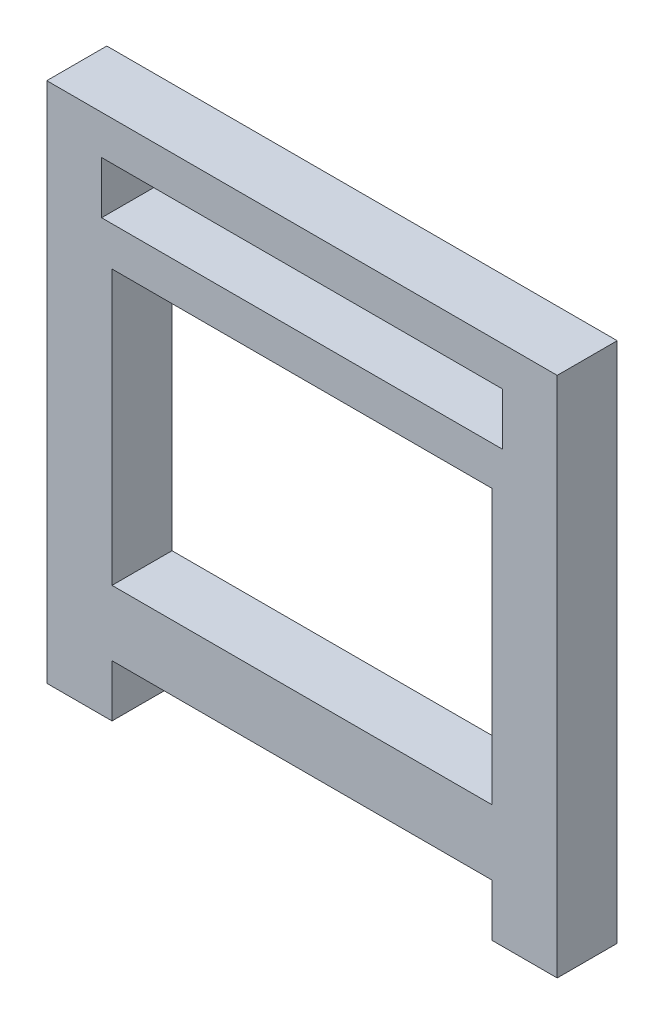
ISO-10303-21;
HEADER;
FILE_DESCRIPTION(('STEP AP214'),'2;1');
FILE_NAME('part.step','',(''),(''),'','','');
FILE_SCHEMA(('AUTOMOTIVE_DESIGN { 1 0 10303 214 1 1 1 1 }'));
ENDSEC;
DATA;
#1=APPLICATION_CONTEXT('core data for automotive mechanical design processes');
#2=APPLICATION_PROTOCOL_DEFINITION('international standard','automotive_design',2000,#1);
#3=PRODUCT_CONTEXT('',#1,'mechanical');
#4=PRODUCT('Part','Part','',(#3));
#5=PRODUCT_RELATED_PRODUCT_CATEGORY('part','',(#4));
#6=PRODUCT_DEFINITION_FORMATION('','',#4);
#7=PRODUCT_DEFINITION_CONTEXT('part definition',#1,'design');
#8=PRODUCT_DEFINITION('design','',#6,#7);
#9=PRODUCT_DEFINITION_SHAPE('','',#8);
#10=(LENGTH_UNIT() NAMED_UNIT(*) SI_UNIT(.MILLI.,.METRE.));
#11=(NAMED_UNIT(*) PLANE_ANGLE_UNIT() SI_UNIT($,.RADIAN.));
#12=(NAMED_UNIT(*) SI_UNIT($,.STERADIAN.) SOLID_ANGLE_UNIT());
#13=UNCERTAINTY_MEASURE_WITH_UNIT(LENGTH_MEASURE(1.E-05),#10,'distance_accuracy_value','');
#14=(GEOMETRIC_REPRESENTATION_CONTEXT(3) GLOBAL_UNCERTAINTY_ASSIGNED_CONTEXT((#13)) GLOBAL_UNIT_ASSIGNED_CONTEXT((#10,
#11,#12)) REPRESENTATION_CONTEXT('',''));
#15=CARTESIAN_POINT('',(0.,0.,0.));
#16=DIRECTION('',(0.,0.,1.));
#17=DIRECTION('',(1.,0.,0.));
#18=AXIS2_PLACEMENT_3D('',#15,#16,#17);
#19=CARTESIAN_POINT('',(0.,0.,2.3));
#20=DIRECTION('',(0.,0.,-1.));
#21=DIRECTION('',(-1.,0.,0.));
#22=AXIS2_PLACEMENT_3D('',#19,#20,#21);
#23=PLANE('',#22);
#24=DIRECTION('',(0.,1.,0.));
#25=VECTOR('',#24,1.);
#26=CARTESIAN_POINT('',(17.06,2.5,2.3));
#27=LINE('',#26,#25);
#28=CARTESIAN_POINT('',(17.06,2.5,2.3));
#29=VERTEX_POINT('',#28);
#30=CARTESIAN_POINT('',(17.06,13.,2.3));
#31=VERTEX_POINT('',#30);
#32=EDGE_CURVE('E188',#29,#31,#27,.T.);
#33=ORIENTED_EDGE('',*,*,#32,.F.);
#34=DIRECTION('',(1.,0.,0.));
#35=VECTOR('',#34,1.);
#36=CARTESIAN_POINT('',(2.5,2.5,2.3));
#37=LINE('',#36,#35);
#38=CARTESIAN_POINT('',(2.5,2.5,2.3));
#39=VERTEX_POINT('',#38);
#40=EDGE_CURVE('E196',#39,#29,#37,.T.);
#41=ORIENTED_EDGE('',*,*,#40,.F.);
#42=DIRECTION('',(0.,-1.,0.));
#43=VECTOR('',#42,1.);
#44=CARTESIAN_POINT('',(2.5,2.5,2.3));
#45=LINE('',#44,#43);
#46=CARTESIAN_POINT('',(2.5,13.,2.3));
#47=VERTEX_POINT('',#46);
#48=EDGE_CURVE('E193',#47,#39,#45,.T.);
#49=ORIENTED_EDGE('',*,*,#48,.F.);
#50=DIRECTION('',(-1.,0.,0.));
#51=VECTOR('',#50,1.);
#52=CARTESIAN_POINT('',(2.5,13.,2.3));
#53=LINE('',#52,#51);
#54=EDGE_CURVE('E190',#31,#47,#53,.T.);
#55=ORIENTED_EDGE('',*,*,#54,.F.);
#56=EDGE_LOOP('',(#33,#41,#49,#55));
#57=FACE_BOUND('',#56,.T.);
#58=DIRECTION('',(0.,-1.,0.));
#59=VECTOR('',#58,1.);
#60=CARTESIAN_POINT('',(0.,0.,2.3));
#61=LINE('',#60,#59);
#62=CARTESIAN_POINT('',(0.,18.,2.3));
#63=VERTEX_POINT('',#62);
#64=CARTESIAN_POINT('',(0.,-2.,2.3));
#65=VERTEX_POINT('',#64);
#66=EDGE_CURVE('E219',#63,#65,#61,.T.);
#67=ORIENTED_EDGE('',*,*,#66,.T.);
#68=DIRECTION('',(1.,0.,0.));
#69=VECTOR('',#68,1.);
#70=CARTESIAN_POINT('',(0.,-2.,2.3));
#71=LINE('',#70,#69);
#72=CARTESIAN_POINT('',(2.5,-2.,2.3));
#73=VERTEX_POINT('',#72);
#74=EDGE_CURVE('E221',#65,#73,#71,.T.);
#75=ORIENTED_EDGE('',*,*,#74,.T.);
#76=DIRECTION('',(0.,1.,0.));
#77=VECTOR('',#76,1.);
#78=CARTESIAN_POINT('',(2.5,-2.,2.3));
#79=LINE('',#78,#77);
#80=CARTESIAN_POINT('',(2.5,0.,2.3));
#81=VERTEX_POINT('',#80);
#82=EDGE_CURVE('E224',#73,#81,#79,.T.);
#83=ORIENTED_EDGE('',*,*,#82,.T.);
#84=DIRECTION('',(1.,0.,0.));
#85=VECTOR('',#84,1.);
#86=CARTESIAN_POINT('',(2.5,0.,2.3));
#87=LINE('',#86,#85);
#88=CARTESIAN_POINT('',(17.06,0.,2.3));
#89=VERTEX_POINT('',#88);
#90=EDGE_CURVE('E226',#81,#89,#87,.T.);
#91=ORIENTED_EDGE('',*,*,#90,.T.);
#92=DIRECTION('',(0.,-1.,0.));
#93=VECTOR('',#92,1.);
#94=CARTESIAN_POINT('',(17.06,-2.,2.3));
#95=LINE('',#94,#93);
#96=CARTESIAN_POINT('',(17.06,-2.,2.3));
#97=VERTEX_POINT('',#96);
#98=EDGE_CURVE('E228',#89,#97,#95,.T.);
#99=ORIENTED_EDGE('',*,*,#98,.T.);
#100=DIRECTION('',(1.,0.,0.));
#101=VECTOR('',#100,1.);
#102=CARTESIAN_POINT('',(19.56,-2.,2.3));
#103=LINE('',#102,#101);
#104=CARTESIAN_POINT('',(19.56,-2.,2.3));
#105=VERTEX_POINT('',#104);
#106=EDGE_CURVE('E230',#97,#105,#103,.T.);
#107=ORIENTED_EDGE('',*,*,#106,.T.);
#108=DIRECTION('',(0.,1.,0.));
#109=VECTOR('',#108,1.);
#110=CARTESIAN_POINT('',(19.56,0.,2.3));
#111=LINE('',#110,#109);
#112=CARTESIAN_POINT('',(19.56,18.,2.3));
#113=VERTEX_POINT('',#112);
#114=EDGE_CURVE('E232',#105,#113,#111,.T.);
#115=ORIENTED_EDGE('',*,*,#114,.T.);
#116=DIRECTION('',(-1.,0.,0.));
#117=VECTOR('',#116,1.);
#118=CARTESIAN_POINT('',(0.,18.,2.3));
#119=LINE('',#118,#117);
#120=EDGE_CURVE('E234',#113,#63,#119,.T.);
#121=ORIENTED_EDGE('',*,*,#120,.T.);
#122=EDGE_LOOP('',(#67,#75,#83,#91,#99,#107,#115,#121));
#123=FACE_BOUND('',#122,.T.);
#124=DIRECTION('',(0.,-1.,0.));
#125=VECTOR('',#124,1.);
#126=CARTESIAN_POINT('',(2.1,14.5,2.3));
#127=LINE('',#126,#125);
#128=CARTESIAN_POINT('',(2.1,16.5,2.3));
#129=VERTEX_POINT('',#128);
#130=CARTESIAN_POINT('',(2.1,14.5,2.3));
#131=VERTEX_POINT('',#130);
#132=EDGE_CURVE('E152',#129,#131,#127,.T.);
#133=ORIENTED_EDGE('',*,*,#132,.F.);
#134=DIRECTION('',(-1.,0.,0.));
#135=VECTOR('',#134,1.);
#136=CARTESIAN_POINT('',(2.1,16.5,2.3));
#137=LINE('',#136,#135);
#138=CARTESIAN_POINT('',(17.46,16.5,2.3));
#139=VERTEX_POINT('',#138);
#140=EDGE_CURVE('E174',#139,#129,#137,.T.);
#141=ORIENTED_EDGE('',*,*,#140,.F.);
#142=DIRECTION('',(0.,1.,0.));
#143=VECTOR('',#142,1.);
#144=CARTESIAN_POINT('',(17.46,14.5,2.3));
#145=LINE('',#144,#143);
#146=CARTESIAN_POINT('',(17.46,14.5,2.3));
#147=VERTEX_POINT('',#146);
#148=EDGE_CURVE('E172',#147,#139,#145,.T.);
#149=ORIENTED_EDGE('',*,*,#148,.F.);
#150=DIRECTION('',(1.,0.,0.));
#151=VECTOR('',#150,1.);
#152=CARTESIAN_POINT('',(2.1,14.5,2.3));
#153=LINE('',#152,#151);
#154=EDGE_CURVE('E160',#131,#147,#153,.T.);
#155=ORIENTED_EDGE('',*,*,#154,.F.);
#156=EDGE_LOOP('',(#133,#141,#149,#155));
#157=FACE_BOUND('',#156,.T.);
#158=ADVANCED_FACE('F39',(#57,#123,#157),#23,.F.);
#159=CARTESIAN_POINT('',(0.,0.,0.));
#160=DIRECTION('',(0.,0.,-1.));
#161=DIRECTION('',(-1.,0.,0.));
#162=AXIS2_PLACEMENT_3D('',#159,#160,#161);
#163=PLANE('',#162);
#164=DIRECTION('',(0.,-1.,0.));
#165=VECTOR('',#164,1.);
#166=CARTESIAN_POINT('',(0.,0.,0.));
#167=LINE('',#166,#165);
#168=CARTESIAN_POINT('',(0.,18.,0.));
#169=VERTEX_POINT('',#168);
#170=CARTESIAN_POINT('',(0.,-2.,0.));
#171=VERTEX_POINT('',#170);
#172=EDGE_CURVE('E218',#169,#171,#167,.T.);
#173=ORIENTED_EDGE('',*,*,#172,.F.);
#174=DIRECTION('',(-1.,0.,0.));
#175=VECTOR('',#174,1.);
#176=CARTESIAN_POINT('',(0.,18.,0.));
#177=LINE('',#176,#175);
#178=CARTESIAN_POINT('',(19.56,18.,0.));
#179=VERTEX_POINT('',#178);
#180=EDGE_CURVE('E222',#179,#169,#177,.T.);
#181=ORIENTED_EDGE('',*,*,#180,.F.);
#182=DIRECTION('',(0.,1.,0.));
#183=VECTOR('',#182,1.);
#184=CARTESIAN_POINT('',(19.56,0.,0.));
#185=LINE('',#184,#183);
#186=CARTESIAN_POINT('',(19.56,-2.,0.));
#187=VERTEX_POINT('',#186);
#188=EDGE_CURVE('E249',#187,#179,#185,.T.);
#189=ORIENTED_EDGE('',*,*,#188,.F.);
#190=DIRECTION('',(1.,0.,0.));
#191=VECTOR('',#190,1.);
#192=CARTESIAN_POINT('',(19.56,-2.,0.));
#193=LINE('',#192,#191);
#194=CARTESIAN_POINT('',(17.06,-2.,0.));
#195=VERTEX_POINT('',#194);
#196=EDGE_CURVE('E246',#195,#187,#193,.T.);
#197=ORIENTED_EDGE('',*,*,#196,.F.);
#198=DIRECTION('',(0.,-1.,0.));
#199=VECTOR('',#198,1.);
#200=CARTESIAN_POINT('',(17.06,-2.,0.));
#201=LINE('',#200,#199);
#202=CARTESIAN_POINT('',(17.06,0.,0.));
#203=VERTEX_POINT('',#202);
#204=EDGE_CURVE('E244',#203,#195,#201,.T.);
#205=ORIENTED_EDGE('',*,*,#204,.F.);
#206=DIRECTION('',(1.,0.,0.));
#207=VECTOR('',#206,1.);
#208=CARTESIAN_POINT('',(2.5,0.,0.));
#209=LINE('',#208,#207);
#210=CARTESIAN_POINT('',(2.5,0.,0.));
#211=VERTEX_POINT('',#210);
#212=EDGE_CURVE('E242',#211,#203,#209,.T.);
#213=ORIENTED_EDGE('',*,*,#212,.F.);
#214=DIRECTION('',(0.,1.,0.));
#215=VECTOR('',#214,1.);
#216=CARTESIAN_POINT('',(2.5,-2.,0.));
#217=LINE('',#216,#215);
#218=CARTESIAN_POINT('',(2.5,-2.,0.));
#219=VERTEX_POINT('',#218);
#220=EDGE_CURVE('E240',#219,#211,#217,.T.);
#221=ORIENTED_EDGE('',*,*,#220,.F.);
#222=DIRECTION('',(1.,0.,0.));
#223=VECTOR('',#222,1.);
#224=CARTESIAN_POINT('',(0.,-2.,0.));
#225=LINE('',#224,#223);
#226=EDGE_CURVE('E238',#171,#219,#225,.T.);
#227=ORIENTED_EDGE('',*,*,#226,.F.);
#228=EDGE_LOOP('',(#173,#181,#189,#197,#205,#213,#221,#227));
#229=FACE_BOUND('',#228,.T.);
#230=DIRECTION('',(1.,0.,0.));
#231=VECTOR('',#230,1.);
#232=CARTESIAN_POINT('',(2.5,2.5,0.));
#233=LINE('',#232,#231);
#234=CARTESIAN_POINT('',(2.5,2.5,0.));
#235=VERTEX_POINT('',#234);
#236=CARTESIAN_POINT('',(17.06,2.5,0.));
#237=VERTEX_POINT('',#236);
#238=EDGE_CURVE('E191',#235,#237,#233,.T.);
#239=ORIENTED_EDGE('',*,*,#238,.T.);
#240=DIRECTION('',(0.,1.,0.));
#241=VECTOR('',#240,1.);
#242=CARTESIAN_POINT('',(17.06,2.5,0.));
#243=LINE('',#242,#241);
#244=CARTESIAN_POINT('',(17.06,13.,0.));
#245=VERTEX_POINT('',#244);
#246=EDGE_CURVE('E168',#237,#245,#243,.T.);
#247=ORIENTED_EDGE('',*,*,#246,.T.);
#248=DIRECTION('',(-1.,0.,0.));
#249=VECTOR('',#248,1.);
#250=CARTESIAN_POINT('',(2.5,13.,0.));
#251=LINE('',#250,#249);
#252=CARTESIAN_POINT('',(2.5,13.,0.));
#253=VERTEX_POINT('',#252);
#254=EDGE_CURVE('E201',#245,#253,#251,.T.);
#255=ORIENTED_EDGE('',*,*,#254,.T.);
#256=DIRECTION('',(0.,-1.,0.));
#257=VECTOR('',#256,1.);
#258=CARTESIAN_POINT('',(2.5,2.5,0.));
#259=LINE('',#258,#257);
#260=EDGE_CURVE('E204',#253,#235,#259,.T.);
#261=ORIENTED_EDGE('',*,*,#260,.T.);
#262=EDGE_LOOP('',(#239,#247,#255,#261));
#263=FACE_BOUND('',#262,.T.);
#264=DIRECTION('',(-1.,0.,0.));
#265=VECTOR('',#264,1.);
#266=CARTESIAN_POINT('',(2.1,16.5,0.));
#267=LINE('',#266,#265);
#268=CARTESIAN_POINT('',(17.46,16.5,0.));
#269=VERTEX_POINT('',#268);
#270=CARTESIAN_POINT('',(2.1,16.5,0.));
#271=VERTEX_POINT('',#270);
#272=EDGE_CURVE('E161',#269,#271,#267,.T.);
#273=ORIENTED_EDGE('',*,*,#272,.T.);
#274=DIRECTION('',(0.,-1.,0.));
#275=VECTOR('',#274,1.);
#276=CARTESIAN_POINT('',(2.1,14.5,0.));
#277=LINE('',#276,#275);
#278=CARTESIAN_POINT('',(2.1,14.5,0.));
#279=VERTEX_POINT('',#278);
#280=EDGE_CURVE('E62',#271,#279,#277,.T.);
#281=ORIENTED_EDGE('',*,*,#280,.T.);
#282=DIRECTION('',(1.,0.,0.));
#283=VECTOR('',#282,1.);
#284=CARTESIAN_POINT('',(2.1,14.5,0.));
#285=LINE('',#284,#283);
#286=CARTESIAN_POINT('',(17.46,14.5,0.));
#287=VERTEX_POINT('',#286);
#288=EDGE_CURVE('E167',#279,#287,#285,.T.);
#289=ORIENTED_EDGE('',*,*,#288,.T.);
#290=DIRECTION('',(0.,1.,0.));
#291=VECTOR('',#290,1.);
#292=CARTESIAN_POINT('',(17.46,14.5,0.));
#293=LINE('',#292,#291);
#294=EDGE_CURVE('E180',#287,#269,#293,.T.);
#295=ORIENTED_EDGE('',*,*,#294,.T.);
#296=EDGE_LOOP('',(#273,#281,#289,#295));
#297=FACE_BOUND('',#296,.T.);
#298=ADVANCED_FACE('F281',(#229,#263,#297),#163,.T.);
#299=CARTESIAN_POINT('',(0.,0.,2.3));
#300=DIRECTION('',(1.,0.,0.));
#301=DIRECTION('',(0.,1.,0.));
#302=AXIS2_PLACEMENT_3D('',#299,#300,#301);
#303=PLANE('',#302);
#304=ORIENTED_EDGE('',*,*,#172,.T.);
#305=DIRECTION('',(0.,0.,-1.));
#306=VECTOR('',#305,1.);
#307=CARTESIAN_POINT('',(0.,-2.,2.3));
#308=LINE('',#307,#306);
#309=EDGE_CURVE('E11',#65,#171,#308,.T.);
#310=ORIENTED_EDGE('',*,*,#309,.F.);
#311=ORIENTED_EDGE('',*,*,#66,.F.);
#312=DIRECTION('',(0.,0.,-1.));
#313=VECTOR('',#312,1.);
#314=CARTESIAN_POINT('',(0.,18.,2.3));
#315=LINE('',#314,#313);
#316=EDGE_CURVE('E236',#63,#169,#315,.T.);
#317=ORIENTED_EDGE('',*,*,#316,.T.);
#318=EDGE_LOOP('',(#304,#310,#311,#317));
#319=FACE_BOUND('',#318,.T.);
#320=ADVANCED_FACE('F41',(#319),#303,.F.);
#321=CARTESIAN_POINT('',(0.,-2.,2.3));
#322=DIRECTION('',(0.,1.,0.));
#323=DIRECTION('',(0.,0.,1.));
#324=AXIS2_PLACEMENT_3D('',#321,#322,#323);
#325=PLANE('',#324);
#326=ORIENTED_EDGE('',*,*,#226,.T.);
#327=DIRECTION('',(0.,0.,-1.));
#328=VECTOR('',#327,1.);
#329=CARTESIAN_POINT('',(2.5,-2.,2.3));
#330=LINE('',#329,#328);
#331=EDGE_CURVE('E47',#73,#219,#330,.T.);
#332=ORIENTED_EDGE('',*,*,#331,.F.);
#333=ORIENTED_EDGE('',*,*,#74,.F.);
#334=ORIENTED_EDGE('',*,*,#309,.T.);
#335=EDGE_LOOP('',(#326,#332,#333,#334));
#336=FACE_BOUND('',#335,.T.);
#337=ADVANCED_FACE('F298',(#336),#325,.F.);
#338=CARTESIAN_POINT('',(2.5,-2.,2.3));
#339=DIRECTION('',(-1.,0.,0.));
#340=DIRECTION('',(0.,0.,1.));
#341=AXIS2_PLACEMENT_3D('',#338,#339,#340);
#342=PLANE('',#341);
#343=ORIENTED_EDGE('',*,*,#220,.T.);
#344=DIRECTION('',(0.,0.,-1.));
#345=VECTOR('',#344,1.);
#346=CARTESIAN_POINT('',(2.5,0.,2.3));
#347=LINE('',#346,#345);
#348=EDGE_CURVE('E267',#81,#211,#347,.T.);
#349=ORIENTED_EDGE('',*,*,#348,.F.);
#350=ORIENTED_EDGE('',*,*,#82,.F.);
#351=ORIENTED_EDGE('',*,*,#331,.T.);
#352=EDGE_LOOP('',(#343,#349,#350,#351));
#353=FACE_BOUND('',#352,.T.);
#354=ADVANCED_FACE('F274',(#353),#342,.F.);
#355=CARTESIAN_POINT('',(2.5,0.,2.3));
#356=DIRECTION('',(0.,1.,0.));
#357=DIRECTION('',(0.,0.,1.));
#358=AXIS2_PLACEMENT_3D('',#355,#356,#357);
#359=PLANE('',#358);
#360=ORIENTED_EDGE('',*,*,#212,.T.);
#361=DIRECTION('',(0.,0.,-1.));
#362=VECTOR('',#361,1.);
#363=CARTESIAN_POINT('',(17.06,0.,2.3));
#364=LINE('',#363,#362);
#365=EDGE_CURVE('E264',#89,#203,#364,.T.);
#366=ORIENTED_EDGE('',*,*,#365,.F.);
#367=ORIENTED_EDGE('',*,*,#90,.F.);
#368=ORIENTED_EDGE('',*,*,#348,.T.);
#369=EDGE_LOOP('',(#360,#366,#367,#368));
#370=FACE_BOUND('',#369,.T.);
#371=ADVANCED_FACE('F287',(#370),#359,.F.);
#372=CARTESIAN_POINT('',(17.06,-2.,2.3));
#373=DIRECTION('',(1.,0.,0.));
#374=DIRECTION('',(0.,0.,-1.));
#375=AXIS2_PLACEMENT_3D('',#372,#373,#374);
#376=PLANE('',#375);
#377=ORIENTED_EDGE('',*,*,#204,.T.);
#378=DIRECTION('',(0.,0.,-1.));
#379=VECTOR('',#378,1.);
#380=CARTESIAN_POINT('',(17.06,-2.,2.3));
#381=LINE('',#380,#379);
#382=EDGE_CURVE('E261',#97,#195,#381,.T.);
#383=ORIENTED_EDGE('',*,*,#382,.F.);
#384=ORIENTED_EDGE('',*,*,#98,.F.);
#385=ORIENTED_EDGE('',*,*,#365,.T.);
#386=EDGE_LOOP('',(#377,#383,#384,#385));
#387=FACE_BOUND('',#386,.T.);
#388=ADVANCED_FACE('F291',(#387),#376,.F.);
#389=CARTESIAN_POINT('',(19.56,-2.,2.3));
#390=DIRECTION('',(0.,1.,0.));
#391=DIRECTION('',(-1.,0.,0.));
#392=AXIS2_PLACEMENT_3D('',#389,#390,#391);
#393=PLANE('',#392);
#394=ORIENTED_EDGE('',*,*,#196,.T.);
#395=DIRECTION('',(0.,0.,-1.));
#396=VECTOR('',#395,1.);
#397=CARTESIAN_POINT('',(19.56,-2.,2.3));
#398=LINE('',#397,#396);
#399=EDGE_CURVE('E258',#105,#187,#398,.T.);
#400=ORIENTED_EDGE('',*,*,#399,.F.);
#401=ORIENTED_EDGE('',*,*,#106,.F.);
#402=ORIENTED_EDGE('',*,*,#382,.T.);
#403=EDGE_LOOP('',(#394,#400,#401,#402));
#404=FACE_BOUND('',#403,.T.);
#405=ADVANCED_FACE('F310',(#404),#393,.F.);
#406=CARTESIAN_POINT('',(19.56,0.,2.3));
#407=DIRECTION('',(-1.,0.,0.));
#408=DIRECTION('',(0.,0.,1.));
#409=AXIS2_PLACEMENT_3D('',#406,#407,#408);
#410=PLANE('',#409);
#411=ORIENTED_EDGE('',*,*,#188,.T.);
#412=DIRECTION('',(0.,0.,-1.));
#413=VECTOR('',#412,1.);
#414=CARTESIAN_POINT('',(19.56,18.,2.3));
#415=LINE('',#414,#413);
#416=EDGE_CURVE('E255',#113,#179,#415,.T.);
#417=ORIENTED_EDGE('',*,*,#416,.F.);
#418=ORIENTED_EDGE('',*,*,#114,.F.);
#419=ORIENTED_EDGE('',*,*,#399,.T.);
#420=EDGE_LOOP('',(#411,#417,#418,#419));
#421=FACE_BOUND('',#420,.T.);
#422=ADVANCED_FACE('F308',(#421),#410,.F.);
#423=CARTESIAN_POINT('',(0.,18.,2.3));
#424=DIRECTION('',(0.,-1.,0.));
#425=DIRECTION('',(0.,0.,-1.));
#426=AXIS2_PLACEMENT_3D('',#423,#424,#425);
#427=PLANE('',#426);
#428=ORIENTED_EDGE('',*,*,#180,.T.);
#429=ORIENTED_EDGE('',*,*,#316,.F.);
#430=ORIENTED_EDGE('',*,*,#120,.F.);
#431=ORIENTED_EDGE('',*,*,#416,.T.);
#432=EDGE_LOOP('',(#428,#429,#430,#431));
#433=FACE_BOUND('',#432,.T.);
#434=ADVANCED_FACE('F303',(#433),#427,.F.);
#435=CARTESIAN_POINT('',(17.06,2.5,2.3));
#436=DIRECTION('',(-1.,0.,0.));
#437=DIRECTION('',(0.,0.,1.));
#438=AXIS2_PLACEMENT_3D('',#435,#436,#437);
#439=PLANE('',#438);
#440=ORIENTED_EDGE('',*,*,#246,.F.);
#441=DIRECTION('',(0.,0.,-1.));
#442=VECTOR('',#441,1.);
#443=CARTESIAN_POINT('',(17.06,2.5,2.3));
#444=LINE('',#443,#442);
#445=EDGE_CURVE('E198',#29,#237,#444,.T.);
#446=ORIENTED_EDGE('',*,*,#445,.F.);
#447=ORIENTED_EDGE('',*,*,#32,.T.);
#448=DIRECTION('',(0.,0.,-1.));
#449=VECTOR('',#448,1.);
#450=CARTESIAN_POINT('',(17.06,13.,2.3));
#451=LINE('',#450,#449);
#452=EDGE_CURVE('E215',#31,#245,#451,.T.);
#453=ORIENTED_EDGE('',*,*,#452,.T.);
#454=EDGE_LOOP('',(#440,#446,#447,#453));
#455=FACE_BOUND('',#454,.T.);
#456=ADVANCED_FACE('F328',(#455),#439,.T.);
#457=CARTESIAN_POINT('',(2.5,13.,2.3));
#458=DIRECTION('',(0.,-1.,0.));
#459=DIRECTION('',(0.,0.,-1.));
#460=AXIS2_PLACEMENT_3D('',#457,#458,#459);
#461=PLANE('',#460);
#462=ORIENTED_EDGE('',*,*,#254,.F.);
#463=ORIENTED_EDGE('',*,*,#452,.F.);
#464=ORIENTED_EDGE('',*,*,#54,.T.);
#465=DIRECTION('',(0.,0.,-1.));
#466=VECTOR('',#465,1.);
#467=CARTESIAN_POINT('',(2.5,13.,2.3));
#468=LINE('',#467,#466);
#469=EDGE_CURVE('E213',#47,#253,#468,.T.);
#470=ORIENTED_EDGE('',*,*,#469,.T.);
#471=EDGE_LOOP('',(#462,#463,#464,#470));
#472=FACE_BOUND('',#471,.T.);
#473=ADVANCED_FACE('F335',(#472),#461,.T.);
#474=CARTESIAN_POINT('',(2.5,2.5,2.3));
#475=DIRECTION('',(1.,0.,0.));
#476=DIRECTION('',(0.,0.,-1.));
#477=AXIS2_PLACEMENT_3D('',#474,#475,#476);
#478=PLANE('',#477);
#479=ORIENTED_EDGE('',*,*,#260,.F.);
#480=ORIENTED_EDGE('',*,*,#469,.F.);
#481=ORIENTED_EDGE('',*,*,#48,.T.);
#482=DIRECTION('',(0.,0.,-1.));
#483=VECTOR('',#482,1.);
#484=CARTESIAN_POINT('',(2.5,2.5,2.3));
#485=LINE('',#484,#483);
#486=EDGE_CURVE('E211',#39,#235,#485,.T.);
#487=ORIENTED_EDGE('',*,*,#486,.T.);
#488=EDGE_LOOP('',(#479,#480,#481,#487));
#489=FACE_BOUND('',#488,.T.);
#490=ADVANCED_FACE('F340',(#489),#478,.T.);
#491=CARTESIAN_POINT('',(2.5,2.5,2.3));
#492=DIRECTION('',(0.,1.,0.));
#493=DIRECTION('',(0.,0.,1.));
#494=AXIS2_PLACEMENT_3D('',#491,#492,#493);
#495=PLANE('',#494);
#496=ORIENTED_EDGE('',*,*,#238,.F.);
#497=ORIENTED_EDGE('',*,*,#486,.F.);
#498=ORIENTED_EDGE('',*,*,#40,.T.);
#499=ORIENTED_EDGE('',*,*,#445,.T.);
#500=EDGE_LOOP('',(#496,#497,#498,#499));
#501=FACE_BOUND('',#500,.T.);
#502=ADVANCED_FACE('F346',(#501),#495,.T.);
#503=CARTESIAN_POINT('',(2.1,14.5,2.3));
#504=DIRECTION('',(1.,0.,0.));
#505=DIRECTION('',(0.,0.,-1.));
#506=AXIS2_PLACEMENT_3D('',#503,#504,#505);
#507=PLANE('',#506);
#508=ORIENTED_EDGE('',*,*,#280,.F.);
#509=DIRECTION('',(0.,0.,-1.));
#510=VECTOR('',#509,1.);
#511=CARTESIAN_POINT('',(2.1,16.5,2.3));
#512=LINE('',#511,#510);
#513=EDGE_CURVE('E156',#129,#271,#512,.T.);
#514=ORIENTED_EDGE('',*,*,#513,.F.);
#515=ORIENTED_EDGE('',*,*,#132,.T.);
#516=DIRECTION('',(0.,0.,-1.));
#517=VECTOR('',#516,1.);
#518=CARTESIAN_POINT('',(2.1,14.5,2.3));
#519=LINE('',#518,#517);
#520=EDGE_CURVE('E155',#131,#279,#519,.T.);
#521=ORIENTED_EDGE('',*,*,#520,.T.);
#522=EDGE_LOOP('',(#508,#514,#515,#521));
#523=FACE_BOUND('',#522,.T.);
#524=ADVANCED_FACE('F154',(#523),#507,.T.);
#525=CARTESIAN_POINT('',(2.1,14.5,2.3));
#526=DIRECTION('',(0.,1.,0.));
#527=DIRECTION('',(0.,0.,1.));
#528=AXIS2_PLACEMENT_3D('',#525,#526,#527);
#529=PLANE('',#528);
#530=ORIENTED_EDGE('',*,*,#288,.F.);
#531=ORIENTED_EDGE('',*,*,#520,.F.);
#532=ORIENTED_EDGE('',*,*,#154,.T.);
#533=DIRECTION('',(0.,0.,-1.));
#534=VECTOR('',#533,1.);
#535=CARTESIAN_POINT('',(17.46,14.5,2.3));
#536=LINE('',#535,#534);
#537=EDGE_CURVE('E169',#147,#287,#536,.T.);
#538=ORIENTED_EDGE('',*,*,#537,.T.);
#539=EDGE_LOOP('',(#530,#531,#532,#538));
#540=FACE_BOUND('',#539,.T.);
#541=ADVANCED_FACE('F164',(#540),#529,.T.);
#542=CARTESIAN_POINT('',(17.46,14.5,2.3));
#543=DIRECTION('',(-1.,0.,0.));
#544=DIRECTION('',(0.,0.,1.));
#545=AXIS2_PLACEMENT_3D('',#542,#543,#544);
#546=PLANE('',#545);
#547=ORIENTED_EDGE('',*,*,#294,.F.);
#548=ORIENTED_EDGE('',*,*,#537,.F.);
#549=ORIENTED_EDGE('',*,*,#148,.T.);
#550=DIRECTION('',(0.,0.,-1.));
#551=VECTOR('',#550,1.);
#552=CARTESIAN_POINT('',(17.46,16.5,2.3));
#553=LINE('',#552,#551);
#554=EDGE_CURVE('E54',#139,#269,#553,.T.);
#555=ORIENTED_EDGE('',*,*,#554,.T.);
#556=EDGE_LOOP('',(#547,#548,#549,#555));
#557=FACE_BOUND('',#556,.T.);
#558=ADVANCED_FACE('F365',(#557),#546,.T.);
#559=CARTESIAN_POINT('',(2.1,16.5,2.3));
#560=DIRECTION('',(0.,-1.,0.));
#561=DIRECTION('',(0.,0.,-1.));
#562=AXIS2_PLACEMENT_3D('',#559,#560,#561);
#563=PLANE('',#562);
#564=ORIENTED_EDGE('',*,*,#272,.F.);
#565=ORIENTED_EDGE('',*,*,#554,.F.);
#566=ORIENTED_EDGE('',*,*,#140,.T.);
#567=ORIENTED_EDGE('',*,*,#513,.T.);
#568=EDGE_LOOP('',(#564,#565,#566,#567));
#569=FACE_BOUND('',#568,.T.);
#570=ADVANCED_FACE('F368',(#569),#563,.T.);
#571=CLOSED_SHELL('',(#158,#298,#320,#337,#354,#371,#388,#405,#422,#434,#456,#473,#490,#502,
#524,#541,#558,#570));
#572=MANIFOLD_SOLID_BREP('B2',#571);
#573=ADVANCED_BREP_SHAPE_REPRESENTATION('',(#18,#572),#14);
#574=SHAPE_DEFINITION_REPRESENTATION(#9,#573);
ENDSEC;
END-ISO-10303-21;
